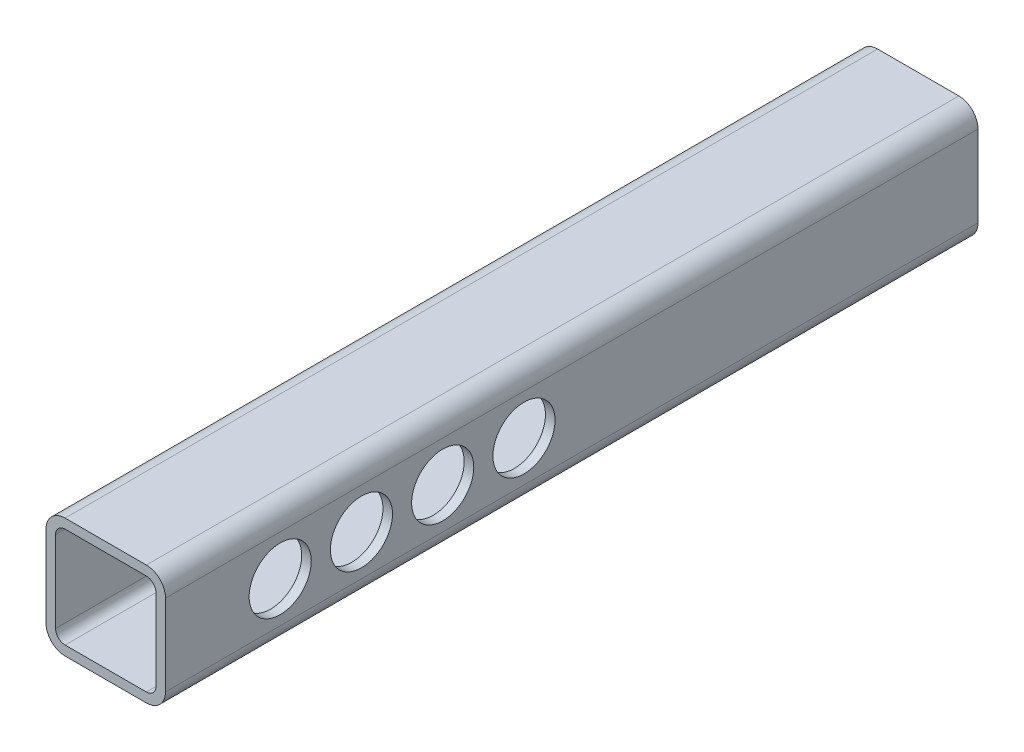
ISO-10303-21;
HEADER;
FILE_DESCRIPTION(('STEP AP214'),'2;1');
FILE_NAME('part.step','',(''),(''),'','','');
FILE_SCHEMA(('AUTOMOTIVE_DESIGN { 1 0 10303 214 1 1 1 1 }'));
ENDSEC;
DATA;
#1=APPLICATION_CONTEXT('core data for automotive mechanical design processes');
#2=APPLICATION_PROTOCOL_DEFINITION('international standard','automotive_design',2000,#1);
#3=PRODUCT_CONTEXT('',#1,'mechanical');
#4=PRODUCT('Part','Part','',(#3));
#5=PRODUCT_RELATED_PRODUCT_CATEGORY('part','',(#4));
#6=PRODUCT_DEFINITION_FORMATION('','',#4);
#7=PRODUCT_DEFINITION_CONTEXT('part definition',#1,'design');
#8=PRODUCT_DEFINITION('design','',#6,#7);
#9=PRODUCT_DEFINITION_SHAPE('','',#8);
#10=(LENGTH_UNIT() NAMED_UNIT(*) SI_UNIT(.MILLI.,.METRE.));
#11=(NAMED_UNIT(*) PLANE_ANGLE_UNIT() SI_UNIT($,.RADIAN.));
#12=(NAMED_UNIT(*) SI_UNIT($,.STERADIAN.) SOLID_ANGLE_UNIT());
#13=UNCERTAINTY_MEASURE_WITH_UNIT(LENGTH_MEASURE(1.E-05),#10,'distance_accuracy_value','');
#14=(GEOMETRIC_REPRESENTATION_CONTEXT(3) GLOBAL_UNCERTAINTY_ASSIGNED_CONTEXT((#13)) GLOBAL_UNIT_ASSIGNED_CONTEXT((#10,
#11,#12)) REPRESENTATION_CONTEXT('',''));
#15=CARTESIAN_POINT('',(0.,0.,0.));
#16=DIRECTION('',(0.,0.,1.));
#17=DIRECTION('',(1.,0.,0.));
#18=AXIS2_PLACEMENT_3D('',#15,#16,#17);
#19=CARTESIAN_POINT('',(-8.5,-8.5,170.));
#20=DIRECTION('',(0.,0.,1.));
#21=DIRECTION('',(1.,0.,0.));
#22=AXIS2_PLACEMENT_3D('',#19,#20,#21);
#23=PLANE('',#22);
#24=CARTESIAN_POINT('',(-8.5,-8.5,170.));
#25=DIRECTION('',(0.,0.,1.));
#26=DIRECTION('',(1.,0.,0.));
#27=AXIS2_PLACEMENT_3D('',#24,#25,#26);
#28=CIRCLE('',#27,4.);
#29=CARTESIAN_POINT('',(-12.5,-8.5,170.));
#30=VERTEX_POINT('',#29);
#31=CARTESIAN_POINT('',(-8.5,-12.5,170.));
#32=VERTEX_POINT('',#31);
#33=EDGE_CURVE('E216',#30,#32,#28,.T.);
#34=ORIENTED_EDGE('',*,*,#33,.T.);
#35=DIRECTION('',(1.,0.,0.));
#36=VECTOR('',#35,1.);
#37=CARTESIAN_POINT('',(8.5,-12.5,170.));
#38=LINE('',#37,#36);
#39=CARTESIAN_POINT('',(8.5,-12.5,170.));
#40=VERTEX_POINT('',#39);
#41=EDGE_CURVE('E219',#32,#40,#38,.T.);
#42=ORIENTED_EDGE('',*,*,#41,.T.);
#43=CARTESIAN_POINT('',(8.5,-8.5,170.));
#44=DIRECTION('',(0.,0.,1.));
#45=DIRECTION('',(1.,0.,0.));
#46=AXIS2_PLACEMENT_3D('',#43,#44,#45);
#47=CIRCLE('',#46,4.);
#48=CARTESIAN_POINT('',(12.5,-8.5,170.));
#49=VERTEX_POINT('',#48);
#50=EDGE_CURVE('E222',#40,#49,#47,.T.);
#51=ORIENTED_EDGE('',*,*,#50,.T.);
#52=DIRECTION('',(0.,1.,0.));
#53=VECTOR('',#52,1.);
#54=CARTESIAN_POINT('',(12.5,-8.5,170.));
#55=LINE('',#54,#53);
#56=CARTESIAN_POINT('',(12.5,8.5,170.));
#57=VERTEX_POINT('',#56);
#58=EDGE_CURVE('E224',#49,#57,#55,.T.);
#59=ORIENTED_EDGE('',*,*,#58,.T.);
#60=CARTESIAN_POINT('',(8.5,8.5,170.));
#61=DIRECTION('',(0.,0.,1.));
#62=DIRECTION('',(1.,0.,0.));
#63=AXIS2_PLACEMENT_3D('',#60,#61,#62);
#64=CIRCLE('',#63,4.);
#65=CARTESIAN_POINT('',(8.5,12.5,170.));
#66=VERTEX_POINT('',#65);
#67=EDGE_CURVE('E226',#57,#66,#64,.T.);
#68=ORIENTED_EDGE('',*,*,#67,.T.);
#69=DIRECTION('',(-1.,0.,0.));
#70=VECTOR('',#69,1.);
#71=CARTESIAN_POINT('',(8.5,12.5,170.));
#72=LINE('',#71,#70);
#73=CARTESIAN_POINT('',(-8.5,12.5,170.));
#74=VERTEX_POINT('',#73);
#75=EDGE_CURVE('E228',#66,#74,#72,.T.);
#76=ORIENTED_EDGE('',*,*,#75,.T.);
#77=CARTESIAN_POINT('',(-8.5,8.5,170.));
#78=DIRECTION('',(0.,0.,1.));
#79=DIRECTION('',(-1.,0.,0.));
#80=AXIS2_PLACEMENT_3D('',#77,#78,#79);
#81=CIRCLE('',#80,4.);
#82=CARTESIAN_POINT('',(-12.5,8.5,170.));
#83=VERTEX_POINT('',#82);
#84=EDGE_CURVE('E230',#74,#83,#81,.T.);
#85=ORIENTED_EDGE('',*,*,#84,.T.);
#86=DIRECTION('',(0.,-1.,0.));
#87=VECTOR('',#86,1.);
#88=CARTESIAN_POINT('',(-12.5,-8.5,170.));
#89=LINE('',#88,#87);
#90=EDGE_CURVE('E232',#83,#30,#89,.T.);
#91=ORIENTED_EDGE('',*,*,#90,.T.);
#92=EDGE_LOOP('',(#34,#42,#51,#59,#68,#76,#85,#91));
#93=FACE_BOUND('',#92,.T.);
#94=DIRECTION('',(1.,0.,0.));
#95=VECTOR('',#94,1.);
#96=CARTESIAN_POINT('',(8.5,-10.5,170.));
#97=LINE('',#96,#95);
#98=CARTESIAN_POINT('',(-8.5,-10.5,170.));
#99=VERTEX_POINT('',#98);
#100=CARTESIAN_POINT('',(8.5,-10.5,170.));
#101=VERTEX_POINT('',#100);
#102=EDGE_CURVE('E157',#99,#101,#97,.T.);
#103=ORIENTED_EDGE('',*,*,#102,.F.);
#104=CARTESIAN_POINT('',(-8.5,-8.5,170.));
#105=DIRECTION('',(0.,0.,1.));
#106=DIRECTION('',(1.,0.,0.));
#107=AXIS2_PLACEMENT_3D('',#104,#105,#106);
#108=CIRCLE('',#107,2.);
#109=CARTESIAN_POINT('',(-10.5,-8.5,170.));
#110=VERTEX_POINT('',#109);
#111=EDGE_CURVE('E149',#110,#99,#108,.T.);
#112=ORIENTED_EDGE('',*,*,#111,.F.);
#113=DIRECTION('',(0.,-1.,0.));
#114=VECTOR('',#113,1.);
#115=CARTESIAN_POINT('',(-10.5,-8.5,170.));
#116=LINE('',#115,#114);
#117=CARTESIAN_POINT('',(-10.5,8.5,170.));
#118=VERTEX_POINT('',#117);
#119=EDGE_CURVE('E183',#118,#110,#116,.T.);
#120=ORIENTED_EDGE('',*,*,#119,.F.);
#121=CARTESIAN_POINT('',(-8.5,8.5,170.));
#122=DIRECTION('',(0.,0.,1.));
#123=DIRECTION('',(-1.,0.,0.));
#124=AXIS2_PLACEMENT_3D('',#121,#122,#123);
#125=CIRCLE('',#124,2.);
#126=CARTESIAN_POINT('',(-8.5,10.5,170.));
#127=VERTEX_POINT('',#126);
#128=EDGE_CURVE('E181',#127,#118,#125,.T.);
#129=ORIENTED_EDGE('',*,*,#128,.F.);
#130=DIRECTION('',(-1.,0.,0.));
#131=VECTOR('',#130,1.);
#132=CARTESIAN_POINT('',(8.5,10.5,170.));
#133=LINE('',#132,#131);
#134=CARTESIAN_POINT('',(8.5,10.5,170.));
#135=VERTEX_POINT('',#134);
#136=EDGE_CURVE('E179',#135,#127,#133,.T.);
#137=ORIENTED_EDGE('',*,*,#136,.F.);
#138=CARTESIAN_POINT('',(8.5,8.5,170.));
#139=DIRECTION('',(0.,0.,1.));
#140=DIRECTION('',(1.,0.,0.));
#141=AXIS2_PLACEMENT_3D('',#138,#139,#140);
#142=CIRCLE('',#141,2.);
#143=CARTESIAN_POINT('',(10.5,8.5,170.));
#144=VERTEX_POINT('',#143);
#145=EDGE_CURVE('E177',#144,#135,#142,.T.);
#146=ORIENTED_EDGE('',*,*,#145,.F.);
#147=DIRECTION('',(0.,1.,0.));
#148=VECTOR('',#147,1.);
#149=CARTESIAN_POINT('',(10.5,-8.5,170.));
#150=LINE('',#149,#148);
#151=CARTESIAN_POINT('',(10.5,-8.5,170.));
#152=VERTEX_POINT('',#151);
#153=EDGE_CURVE('E172',#152,#144,#150,.T.);
#154=ORIENTED_EDGE('',*,*,#153,.F.);
#155=CARTESIAN_POINT('',(8.5,-8.5,170.));
#156=DIRECTION('',(0.,0.,1.));
#157=DIRECTION('',(1.,0.,0.));
#158=AXIS2_PLACEMENT_3D('',#155,#156,#157);
#159=CIRCLE('',#158,2.);
#160=EDGE_CURVE('E170',#101,#152,#159,.T.);
#161=ORIENTED_EDGE('',*,*,#160,.F.);
#162=EDGE_LOOP('',(#103,#112,#120,#129,#137,#146,#154,#161));
#163=FACE_BOUND('',#162,.T.);
#164=ADVANCED_FACE('F34',(#93,#163),#23,.T.);
#165=CARTESIAN_POINT('',(-8.5,-8.5,0.));
#166=DIRECTION('',(0.,0.,1.));
#167=DIRECTION('',(1.,0.,0.));
#168=AXIS2_PLACEMENT_3D('',#165,#166,#167);
#169=PLANE('',#168);
#170=CARTESIAN_POINT('',(-8.5,-8.5,0.));
#171=DIRECTION('',(0.,0.,1.));
#172=DIRECTION('',(1.,0.,0.));
#173=AXIS2_PLACEMENT_3D('',#170,#171,#172);
#174=CIRCLE('',#173,4.);
#175=CARTESIAN_POINT('',(-12.5,-8.5,0.));
#176=VERTEX_POINT('',#175);
#177=CARTESIAN_POINT('',(-8.5,-12.5,0.));
#178=VERTEX_POINT('',#177);
#179=EDGE_CURVE('E165',#176,#178,#174,.T.);
#180=ORIENTED_EDGE('',*,*,#179,.F.);
#181=DIRECTION('',(0.,-1.,0.));
#182=VECTOR('',#181,1.);
#183=CARTESIAN_POINT('',(-12.5,-8.5,0.));
#184=LINE('',#183,#182);
#185=CARTESIAN_POINT('',(-12.5,8.5,0.));
#186=VERTEX_POINT('',#185);
#187=EDGE_CURVE('E220',#186,#176,#184,.T.);
#188=ORIENTED_EDGE('',*,*,#187,.F.);
#189=CARTESIAN_POINT('',(-8.5,8.5,0.));
#190=DIRECTION('',(0.,0.,1.));
#191=DIRECTION('',(-1.,0.,0.));
#192=AXIS2_PLACEMENT_3D('',#189,#190,#191);
#193=CIRCLE('',#192,4.);
#194=CARTESIAN_POINT('',(-8.5,12.5,0.));
#195=VERTEX_POINT('',#194);
#196=EDGE_CURVE('E247',#195,#186,#193,.T.);
#197=ORIENTED_EDGE('',*,*,#196,.F.);
#198=DIRECTION('',(-1.,0.,0.));
#199=VECTOR('',#198,1.);
#200=CARTESIAN_POINT('',(8.5,12.5,0.));
#201=LINE('',#200,#199);
#202=CARTESIAN_POINT('',(8.5,12.5,0.));
#203=VERTEX_POINT('',#202);
#204=EDGE_CURVE('E245',#203,#195,#201,.T.);
#205=ORIENTED_EDGE('',*,*,#204,.F.);
#206=CARTESIAN_POINT('',(8.5,8.5,0.));
#207=DIRECTION('',(0.,0.,1.));
#208=DIRECTION('',(1.,0.,0.));
#209=AXIS2_PLACEMENT_3D('',#206,#207,#208);
#210=CIRCLE('',#209,4.);
#211=CARTESIAN_POINT('',(12.5,8.5,0.));
#212=VERTEX_POINT('',#211);
#213=EDGE_CURVE('E243',#212,#203,#210,.T.);
#214=ORIENTED_EDGE('',*,*,#213,.F.);
#215=DIRECTION('',(0.,1.,0.));
#216=VECTOR('',#215,1.);
#217=CARTESIAN_POINT('',(12.5,-8.5,0.));
#218=LINE('',#217,#216);
#219=CARTESIAN_POINT('',(12.5,-8.5,0.));
#220=VERTEX_POINT('',#219);
#221=EDGE_CURVE('E241',#220,#212,#218,.T.);
#222=ORIENTED_EDGE('',*,*,#221,.F.);
#223=CARTESIAN_POINT('',(8.5,-8.5,0.));
#224=DIRECTION('',(0.,0.,1.));
#225=DIRECTION('',(1.,0.,0.));
#226=AXIS2_PLACEMENT_3D('',#223,#224,#225);
#227=CIRCLE('',#226,4.);
#228=CARTESIAN_POINT('',(8.5,-12.5,0.));
#229=VERTEX_POINT('',#228);
#230=EDGE_CURVE('E239',#229,#220,#227,.T.);
#231=ORIENTED_EDGE('',*,*,#230,.F.);
#232=DIRECTION('',(1.,0.,0.));
#233=VECTOR('',#232,1.);
#234=CARTESIAN_POINT('',(8.5,-12.5,0.));
#235=LINE('',#234,#233);
#236=EDGE_CURVE('E237',#178,#229,#235,.T.);
#237=ORIENTED_EDGE('',*,*,#236,.F.);
#238=EDGE_LOOP('',(#180,#188,#197,#205,#214,#222,#231,#237));
#239=FACE_BOUND('',#238,.T.);
#240=CARTESIAN_POINT('',(-8.5,-8.5,0.));
#241=DIRECTION('',(0.,0.,1.));
#242=DIRECTION('',(1.,0.,0.));
#243=AXIS2_PLACEMENT_3D('',#240,#241,#242);
#244=CIRCLE('',#243,2.);
#245=CARTESIAN_POINT('',(-10.5,-8.5,0.));
#246=VERTEX_POINT('',#245);
#247=CARTESIAN_POINT('',(-8.5,-10.5,0.));
#248=VERTEX_POINT('',#247);
#249=EDGE_CURVE('E59',#246,#248,#244,.T.);
#250=ORIENTED_EDGE('',*,*,#249,.T.);
#251=DIRECTION('',(1.,0.,0.));
#252=VECTOR('',#251,1.);
#253=CARTESIAN_POINT('',(8.5,-10.5,0.));
#254=LINE('',#253,#252);
#255=CARTESIAN_POINT('',(8.5,-10.5,0.));
#256=VERTEX_POINT('',#255);
#257=EDGE_CURVE('E164',#248,#256,#254,.T.);
#258=ORIENTED_EDGE('',*,*,#257,.T.);
#259=CARTESIAN_POINT('',(8.5,-8.5,0.));
#260=DIRECTION('',(0.,0.,1.));
#261=DIRECTION('',(1.,0.,0.));
#262=AXIS2_PLACEMENT_3D('',#259,#260,#261);
#263=CIRCLE('',#262,2.);
#264=CARTESIAN_POINT('',(10.5,-8.5,0.));
#265=VERTEX_POINT('',#264);
#266=EDGE_CURVE('E188',#256,#265,#263,.T.);
#267=ORIENTED_EDGE('',*,*,#266,.T.);
#268=DIRECTION('',(0.,1.,0.));
#269=VECTOR('',#268,1.);
#270=CARTESIAN_POINT('',(10.5,-8.5,0.));
#271=LINE('',#270,#269);
#272=CARTESIAN_POINT('',(10.5,8.5,0.));
#273=VERTEX_POINT('',#272);
#274=EDGE_CURVE('E191',#265,#273,#271,.T.);
#275=ORIENTED_EDGE('',*,*,#274,.T.);
#276=CARTESIAN_POINT('',(8.5,8.5,0.));
#277=DIRECTION('',(0.,0.,1.));
#278=DIRECTION('',(1.,0.,0.));
#279=AXIS2_PLACEMENT_3D('',#276,#277,#278);
#280=CIRCLE('',#279,2.);
#281=CARTESIAN_POINT('',(8.5,10.5,0.));
#282=VERTEX_POINT('',#281);
#283=EDGE_CURVE('E194',#273,#282,#280,.T.);
#284=ORIENTED_EDGE('',*,*,#283,.T.);
#285=DIRECTION('',(-1.,0.,0.));
#286=VECTOR('',#285,1.);
#287=CARTESIAN_POINT('',(8.5,10.5,0.));
#288=LINE('',#287,#286);
#289=CARTESIAN_POINT('',(-8.5,10.5,0.));
#290=VERTEX_POINT('',#289);
#291=EDGE_CURVE('E197',#282,#290,#288,.T.);
#292=ORIENTED_EDGE('',*,*,#291,.T.);
#293=CARTESIAN_POINT('',(-8.5,8.5,0.));
#294=DIRECTION('',(0.,0.,1.));
#295=DIRECTION('',(-1.,0.,0.));
#296=AXIS2_PLACEMENT_3D('',#293,#294,#295);
#297=CIRCLE('',#296,2.);
#298=CARTESIAN_POINT('',(-10.5,8.5,0.));
#299=VERTEX_POINT('',#298);
#300=EDGE_CURVE('E200',#290,#299,#297,.T.);
#301=ORIENTED_EDGE('',*,*,#300,.T.);
#302=DIRECTION('',(0.,-1.,0.));
#303=VECTOR('',#302,1.);
#304=CARTESIAN_POINT('',(-10.5,-8.5,0.));
#305=LINE('',#304,#303);
#306=EDGE_CURVE('E158',#299,#246,#305,.T.);
#307=ORIENTED_EDGE('',*,*,#306,.T.);
#308=EDGE_LOOP('',(#250,#258,#267,#275,#284,#292,#301,#307));
#309=FACE_BOUND('',#308,.T.);
#310=ADVANCED_FACE('F326',(#239,#309),#169,.F.);
#311=CARTESIAN_POINT('',(-8.5,-8.5,170.));
#312=DIRECTION('',(0.,0.,-1.));
#313=DIRECTION('',(-1.,0.,0.));
#314=AXIS2_PLACEMENT_3D('',#311,#312,#313);
#315=CYLINDRICAL_SURFACE('',#314,4.);
#316=ORIENTED_EDGE('',*,*,#179,.T.);
#317=DIRECTION('',(0.,0.,-1.));
#318=VECTOR('',#317,1.);
#319=CARTESIAN_POINT('',(-8.5,-12.5,170.));
#320=LINE('',#319,#318);
#321=EDGE_CURVE('E11',#32,#178,#320,.T.);
#322=ORIENTED_EDGE('',*,*,#321,.F.);
#323=ORIENTED_EDGE('',*,*,#33,.F.);
#324=DIRECTION('',(0.,0.,-1.));
#325=VECTOR('',#324,1.);
#326=CARTESIAN_POINT('',(-12.5,-8.5,170.));
#327=LINE('',#326,#325);
#328=EDGE_CURVE('E234',#30,#176,#327,.T.);
#329=ORIENTED_EDGE('',*,*,#328,.T.);
#330=EDGE_LOOP('',(#316,#322,#323,#329));
#331=FACE_BOUND('',#330,.T.);
#332=ADVANCED_FACE('F36',(#331),#315,.T.);
#333=CARTESIAN_POINT('',(8.5,-12.5,170.));
#334=DIRECTION('',(0.,1.,0.));
#335=DIRECTION('',(-1.,0.,0.));
#336=AXIS2_PLACEMENT_3D('',#333,#334,#335);
#337=PLANE('',#336);
#338=ORIENTED_EDGE('',*,*,#236,.T.);
#339=DIRECTION('',(0.,0.,-1.));
#340=VECTOR('',#339,1.);
#341=CARTESIAN_POINT('',(8.5,-12.5,170.));
#342=LINE('',#341,#340);
#343=EDGE_CURVE('E43',#40,#229,#342,.T.);
#344=ORIENTED_EDGE('',*,*,#343,.F.);
#345=ORIENTED_EDGE('',*,*,#41,.F.);
#346=ORIENTED_EDGE('',*,*,#321,.T.);
#347=EDGE_LOOP('',(#338,#344,#345,#346));
#348=FACE_BOUND('',#347,.T.);
#349=ADVANCED_FACE('F366',(#348),#337,.F.);
#350=CARTESIAN_POINT('',(8.5,-8.5,170.));
#351=DIRECTION('',(0.,0.,-1.));
#352=DIRECTION('',(-1.,0.,0.));
#353=AXIS2_PLACEMENT_3D('',#350,#351,#352);
#354=CYLINDRICAL_SURFACE('',#353,4.);
#355=ORIENTED_EDGE('',*,*,#230,.T.);
#356=DIRECTION('',(0.,0.,-1.));
#357=VECTOR('',#356,1.);
#358=CARTESIAN_POINT('',(12.5,-8.5,170.));
#359=LINE('',#358,#357);
#360=EDGE_CURVE('E264',#49,#220,#359,.T.);
#361=ORIENTED_EDGE('',*,*,#360,.F.);
#362=ORIENTED_EDGE('',*,*,#50,.F.);
#363=ORIENTED_EDGE('',*,*,#343,.T.);
#364=EDGE_LOOP('',(#355,#361,#362,#363));
#365=FACE_BOUND('',#364,.T.);
#366=ADVANCED_FACE('F363',(#365),#354,.T.);
#367=CARTESIAN_POINT('',(12.5,-8.5,170.));
#368=DIRECTION('',(-1.,0.,0.));
#369=DIRECTION('',(0.,0.,1.));
#370=AXIS2_PLACEMENT_3D('',#367,#368,#369);
#371=PLANE('',#370);
#372=CARTESIAN_POINT('',(12.5,0.,95.));
#373=DIRECTION('',(1.,0.,0.));
#374=DIRECTION('',(0.,0.,-1.));
#375=AXIS2_PLACEMENT_3D('',#372,#373,#374);
#376=CIRCLE('',#375,6.5);
#377=CARTESIAN_POINT('',(12.5,0.,88.5));
#378=VERTEX_POINT('',#377);
#379=EDGE_CURVE('E602',#378,#378,#376,.T.);
#380=ORIENTED_EDGE('',*,*,#379,.F.);
#381=EDGE_LOOP('',(#380));
#382=FACE_BOUND('',#381,.T.);
#383=CARTESIAN_POINT('',(12.5,0.,112.));
#384=DIRECTION('',(1.,0.,0.));
#385=DIRECTION('',(0.,0.,-1.));
#386=AXIS2_PLACEMENT_3D('',#383,#384,#385);
#387=CIRCLE('',#386,6.5);
#388=CARTESIAN_POINT('',(12.5,0.,105.5));
#389=VERTEX_POINT('',#388);
#390=EDGE_CURVE('E287',#389,#389,#387,.T.);
#391=ORIENTED_EDGE('',*,*,#390,.F.);
#392=EDGE_LOOP('',(#391));
#393=FACE_BOUND('',#392,.T.);
#394=CARTESIAN_POINT('',(12.5,0.,129.));
#395=DIRECTION('',(1.,0.,0.));
#396=DIRECTION('',(0.,0.,-1.));
#397=AXIS2_PLACEMENT_3D('',#394,#395,#396);
#398=CIRCLE('',#397,6.50000000000002);
#399=CARTESIAN_POINT('',(12.5,0.,122.5));
#400=VERTEX_POINT('',#399);
#401=EDGE_CURVE('E284',#400,#400,#398,.T.);
#402=ORIENTED_EDGE('',*,*,#401,.F.);
#403=EDGE_LOOP('',(#402));
#404=FACE_BOUND('',#403,.T.);
#405=CARTESIAN_POINT('',(12.5,0.,146.));
#406=DIRECTION('',(1.,0.,0.));
#407=DIRECTION('',(0.,0.,-1.));
#408=AXIS2_PLACEMENT_3D('',#405,#406,#407);
#409=CIRCLE('',#408,6.50000000000002);
#410=CARTESIAN_POINT('',(12.5,0.,139.5));
#411=VERTEX_POINT('',#410);
#412=EDGE_CURVE('E303',#411,#411,#409,.T.);
#413=ORIENTED_EDGE('',*,*,#412,.F.);
#414=EDGE_LOOP('',(#413));
#415=FACE_BOUND('',#414,.T.);
#416=ORIENTED_EDGE('',*,*,#221,.T.);
#417=DIRECTION('',(0.,0.,-1.));
#418=VECTOR('',#417,1.);
#419=CARTESIAN_POINT('',(12.5,8.5,170.));
#420=LINE('',#419,#418);
#421=EDGE_CURVE('E261',#57,#212,#420,.T.);
#422=ORIENTED_EDGE('',*,*,#421,.F.);
#423=ORIENTED_EDGE('',*,*,#58,.F.);
#424=ORIENTED_EDGE('',*,*,#360,.T.);
#425=EDGE_LOOP('',(#416,#422,#423,#424));
#426=FACE_BOUND('',#425,.T.);
#427=ADVANCED_FACE('F359',(#382,#393,#404,#415,#426),#371,.F.);
#428=CARTESIAN_POINT('',(8.5,8.5,170.));
#429=DIRECTION('',(0.,0.,-1.));
#430=DIRECTION('',(-1.,0.,0.));
#431=AXIS2_PLACEMENT_3D('',#428,#429,#430);
#432=CYLINDRICAL_SURFACE('',#431,4.);
#433=ORIENTED_EDGE('',*,*,#213,.T.);
#434=DIRECTION('',(0.,0.,-1.));
#435=VECTOR('',#434,1.);
#436=CARTESIAN_POINT('',(8.5,12.5,170.));
#437=LINE('',#436,#435);
#438=EDGE_CURVE('E258',#66,#203,#437,.T.);
#439=ORIENTED_EDGE('',*,*,#438,.F.);
#440=ORIENTED_EDGE('',*,*,#67,.F.);
#441=ORIENTED_EDGE('',*,*,#421,.T.);
#442=EDGE_LOOP('',(#433,#439,#440,#441));
#443=FACE_BOUND('',#442,.T.);
#444=ADVANCED_FACE('F355',(#443),#432,.T.);
#445=CARTESIAN_POINT('',(8.5,12.5,170.));
#446=DIRECTION('',(0.,-1.,0.));
#447=DIRECTION('',(0.,0.,-1.));
#448=AXIS2_PLACEMENT_3D('',#445,#446,#447);
#449=PLANE('',#448);
#450=ORIENTED_EDGE('',*,*,#204,.T.);
#451=DIRECTION('',(0.,0.,-1.));
#452=VECTOR('',#451,1.);
#453=CARTESIAN_POINT('',(-8.5,12.5,170.));
#454=LINE('',#453,#452);
#455=EDGE_CURVE('E255',#74,#195,#454,.T.);
#456=ORIENTED_EDGE('',*,*,#455,.F.);
#457=ORIENTED_EDGE('',*,*,#75,.F.);
#458=ORIENTED_EDGE('',*,*,#438,.T.);
#459=EDGE_LOOP('',(#450,#456,#457,#458));
#460=FACE_BOUND('',#459,.T.);
#461=ADVANCED_FACE('F351',(#460),#449,.F.);
#462=CARTESIAN_POINT('',(-8.5,8.5,170.));
#463=DIRECTION('',(0.,0.,-1.));
#464=DIRECTION('',(-1.,0.,0.));
#465=AXIS2_PLACEMENT_3D('',#462,#463,#464);
#466=CYLINDRICAL_SURFACE('',#465,4.);
#467=ORIENTED_EDGE('',*,*,#196,.T.);
#468=DIRECTION('',(0.,0.,-1.));
#469=VECTOR('',#468,1.);
#470=CARTESIAN_POINT('',(-12.5,8.5,170.));
#471=LINE('',#470,#469);
#472=EDGE_CURVE('E252',#83,#186,#471,.T.);
#473=ORIENTED_EDGE('',*,*,#472,.F.);
#474=ORIENTED_EDGE('',*,*,#84,.F.);
#475=ORIENTED_EDGE('',*,*,#455,.T.);
#476=EDGE_LOOP('',(#467,#473,#474,#475));
#477=FACE_BOUND('',#476,.T.);
#478=ADVANCED_FACE('F347',(#477),#466,.T.);
#479=CARTESIAN_POINT('',(-12.5,-8.5,170.));
#480=DIRECTION('',(1.,0.,0.));
#481=DIRECTION('',(0.,0.,-1.));
#482=AXIS2_PLACEMENT_3D('',#479,#480,#481);
#483=PLANE('',#482);
#484=CARTESIAN_POINT('',(-12.5,0.,95.));
#485=DIRECTION('',(1.,0.,0.));
#486=DIRECTION('',(0.,0.,-1.));
#487=AXIS2_PLACEMENT_3D('',#484,#485,#486);
#488=CIRCLE('',#487,6.5);
#489=CARTESIAN_POINT('',(-12.5,0.,88.5));
#490=VERTEX_POINT('',#489);
#491=EDGE_CURVE('E603',#490,#490,#488,.T.);
#492=ORIENTED_EDGE('',*,*,#491,.T.);
#493=EDGE_LOOP('',(#492));
#494=FACE_BOUND('',#493,.T.);
#495=CARTESIAN_POINT('',(-12.5,0.,112.));
#496=DIRECTION('',(1.,0.,0.));
#497=DIRECTION('',(0.,0.,-1.));
#498=AXIS2_PLACEMENT_3D('',#495,#496,#497);
#499=CIRCLE('',#498,6.5);
#500=CARTESIAN_POINT('',(-12.5,0.,105.5));
#501=VERTEX_POINT('',#500);
#502=EDGE_CURVE('E280',#501,#501,#499,.T.);
#503=ORIENTED_EDGE('',*,*,#502,.T.);
#504=EDGE_LOOP('',(#503));
#505=FACE_BOUND('',#504,.T.);
#506=CARTESIAN_POINT('',(-12.5,0.,129.));
#507=DIRECTION('',(1.,0.,0.));
#508=DIRECTION('',(0.,0.,-1.));
#509=AXIS2_PLACEMENT_3D('',#506,#507,#508);
#510=CIRCLE('',#509,6.50000000000002);
#511=CARTESIAN_POINT('',(-12.5,0.,122.5));
#512=VERTEX_POINT('',#511);
#513=EDGE_CURVE('E276',#512,#512,#510,.T.);
#514=ORIENTED_EDGE('',*,*,#513,.T.);
#515=EDGE_LOOP('',(#514));
#516=FACE_BOUND('',#515,.T.);
#517=CARTESIAN_POINT('',(-12.5,0.,146.));
#518=DIRECTION('',(1.,0.,0.));
#519=DIRECTION('',(0.,0.,-1.));
#520=AXIS2_PLACEMENT_3D('',#517,#518,#519);
#521=CIRCLE('',#520,6.50000000000002);
#522=CARTESIAN_POINT('',(-12.5,0.,139.5));
#523=VERTEX_POINT('',#522);
#524=EDGE_CURVE('E272',#523,#523,#521,.T.);
#525=ORIENTED_EDGE('',*,*,#524,.T.);
#526=EDGE_LOOP('',(#525));
#527=FACE_BOUND('',#526,.T.);
#528=ORIENTED_EDGE('',*,*,#187,.T.);
#529=ORIENTED_EDGE('',*,*,#328,.F.);
#530=ORIENTED_EDGE('',*,*,#90,.F.);
#531=ORIENTED_EDGE('',*,*,#472,.T.);
#532=EDGE_LOOP('',(#528,#529,#530,#531));
#533=FACE_BOUND('',#532,.T.);
#534=ADVANCED_FACE('F344',(#494,#505,#516,#527,#533),#483,.F.);
#535=CARTESIAN_POINT('',(-8.5,-8.5,170.));
#536=DIRECTION('',(0.,0.,-1.));
#537=DIRECTION('',(-1.,0.,0.));
#538=AXIS2_PLACEMENT_3D('',#535,#536,#537);
#539=CYLINDRICAL_SURFACE('',#538,2.);
#540=ORIENTED_EDGE('',*,*,#249,.F.);
#541=DIRECTION('',(0.,0.,-1.));
#542=VECTOR('',#541,1.);
#543=CARTESIAN_POINT('',(-10.5,-8.5,170.));
#544=LINE('',#543,#542);
#545=EDGE_CURVE('E153',#110,#246,#544,.T.);
#546=ORIENTED_EDGE('',*,*,#545,.F.);
#547=ORIENTED_EDGE('',*,*,#111,.T.);
#548=DIRECTION('',(0.,0.,-1.));
#549=VECTOR('',#548,1.);
#550=CARTESIAN_POINT('',(-8.5,-10.5,170.));
#551=LINE('',#550,#549);
#552=EDGE_CURVE('E152',#99,#248,#551,.T.);
#553=ORIENTED_EDGE('',*,*,#552,.T.);
#554=EDGE_LOOP('',(#540,#546,#547,#553));
#555=FACE_BOUND('',#554,.T.);
#556=ADVANCED_FACE('F151',(#555),#539,.F.);
#557=CARTESIAN_POINT('',(8.5,-10.5,170.));
#558=DIRECTION('',(0.,1.,0.));
#559=DIRECTION('',(-1.,0.,0.));
#560=AXIS2_PLACEMENT_3D('',#557,#558,#559);
#561=PLANE('',#560);
#562=ORIENTED_EDGE('',*,*,#257,.F.);
#563=ORIENTED_EDGE('',*,*,#552,.F.);
#564=ORIENTED_EDGE('',*,*,#102,.T.);
#565=DIRECTION('',(0.,0.,-1.));
#566=VECTOR('',#565,1.);
#567=CARTESIAN_POINT('',(8.5,-10.5,170.));
#568=LINE('',#567,#566);
#569=EDGE_CURVE('E166',#101,#256,#568,.T.);
#570=ORIENTED_EDGE('',*,*,#569,.T.);
#571=EDGE_LOOP('',(#562,#563,#564,#570));
#572=FACE_BOUND('',#571,.T.);
#573=ADVANCED_FACE('F161',(#572),#561,.T.);
#574=CARTESIAN_POINT('',(8.5,-8.5,170.));
#575=DIRECTION('',(0.,0.,-1.));
#576=DIRECTION('',(-1.,0.,0.));
#577=AXIS2_PLACEMENT_3D('',#574,#575,#576);
#578=CYLINDRICAL_SURFACE('',#577,2.);
#579=ORIENTED_EDGE('',*,*,#266,.F.);
#580=ORIENTED_EDGE('',*,*,#569,.F.);
#581=ORIENTED_EDGE('',*,*,#160,.T.);
#582=DIRECTION('',(0.,0.,-1.));
#583=VECTOR('',#582,1.);
#584=CARTESIAN_POINT('',(10.5,-8.5,170.));
#585=LINE('',#584,#583);
#586=EDGE_CURVE('E213',#152,#265,#585,.T.);
#587=ORIENTED_EDGE('',*,*,#586,.T.);
#588=EDGE_LOOP('',(#579,#580,#581,#587));
#589=FACE_BOUND('',#588,.T.);
#590=ADVANCED_FACE('F317',(#589),#578,.F.);
#591=CARTESIAN_POINT('',(10.5,-8.5,170.));
#592=DIRECTION('',(-1.,0.,0.));
#593=DIRECTION('',(0.,0.,1.));
#594=AXIS2_PLACEMENT_3D('',#591,#592,#593);
#595=PLANE('',#594);
#596=CARTESIAN_POINT('',(10.5,0.,95.));
#597=DIRECTION('',(-1.,0.,0.));
#598=DIRECTION('',(0.,0.,1.));
#599=AXIS2_PLACEMENT_3D('',#596,#597,#598);
#600=CIRCLE('',#599,6.5);
#601=CARTESIAN_POINT('',(10.5,0.,101.5));
#602=VERTEX_POINT('',#601);
#603=EDGE_CURVE('E292',#602,#602,#600,.T.);
#604=ORIENTED_EDGE('',*,*,#603,.F.);
#605=EDGE_LOOP('',(#604));
#606=FACE_BOUND('',#605,.T.);
#607=CARTESIAN_POINT('',(10.5,0.,112.));
#608=DIRECTION('',(-1.,0.,0.));
#609=DIRECTION('',(0.,0.,1.));
#610=AXIS2_PLACEMENT_3D('',#607,#608,#609);
#611=CIRCLE('',#610,6.5);
#612=CARTESIAN_POINT('',(10.5,0.,118.5));
#613=VERTEX_POINT('',#612);
#614=EDGE_CURVE('E279',#613,#613,#611,.T.);
#615=ORIENTED_EDGE('',*,*,#614,.F.);
#616=EDGE_LOOP('',(#615));
#617=FACE_BOUND('',#616,.T.);
#618=CARTESIAN_POINT('',(10.5,0.,129.));
#619=DIRECTION('',(-1.,0.,0.));
#620=DIRECTION('',(0.,0.,1.));
#621=AXIS2_PLACEMENT_3D('',#618,#619,#620);
#622=CIRCLE('',#621,6.50000000000002);
#623=CARTESIAN_POINT('',(10.5,0.,135.5));
#624=VERTEX_POINT('',#623);
#625=EDGE_CURVE('E275',#624,#624,#622,.T.);
#626=ORIENTED_EDGE('',*,*,#625,.F.);
#627=EDGE_LOOP('',(#626));
#628=FACE_BOUND('',#627,.T.);
#629=CARTESIAN_POINT('',(10.5,0.,146.));
#630=DIRECTION('',(-1.,0.,0.));
#631=DIRECTION('',(0.,0.,1.));
#632=AXIS2_PLACEMENT_3D('',#629,#630,#631);
#633=CIRCLE('',#632,6.50000000000002);
#634=CARTESIAN_POINT('',(10.5,0.,152.5));
#635=VERTEX_POINT('',#634);
#636=EDGE_CURVE('E186',#635,#635,#633,.T.);
#637=ORIENTED_EDGE('',*,*,#636,.F.);
#638=EDGE_LOOP('',(#637));
#639=FACE_BOUND('',#638,.T.);
#640=ORIENTED_EDGE('',*,*,#274,.F.);
#641=ORIENTED_EDGE('',*,*,#586,.F.);
#642=ORIENTED_EDGE('',*,*,#153,.T.);
#643=DIRECTION('',(0.,0.,-1.));
#644=VECTOR('',#643,1.);
#645=CARTESIAN_POINT('',(10.5,8.5,170.));
#646=LINE('',#645,#644);
#647=EDGE_CURVE('E211',#144,#273,#646,.T.);
#648=ORIENTED_EDGE('',*,*,#647,.T.);
#649=EDGE_LOOP('',(#640,#641,#642,#648));
#650=FACE_BOUND('',#649,.T.);
#651=ADVANCED_FACE('F313',(#606,#617,#628,#639,#650),#595,.T.);
#652=CARTESIAN_POINT('',(8.5,8.5,170.));
#653=DIRECTION('',(0.,0.,-1.));
#654=DIRECTION('',(-1.,0.,0.));
#655=AXIS2_PLACEMENT_3D('',#652,#653,#654);
#656=CYLINDRICAL_SURFACE('',#655,2.);
#657=ORIENTED_EDGE('',*,*,#283,.F.);
#658=ORIENTED_EDGE('',*,*,#647,.F.);
#659=ORIENTED_EDGE('',*,*,#145,.T.);
#660=DIRECTION('',(0.,0.,-1.));
#661=VECTOR('',#660,1.);
#662=CARTESIAN_POINT('',(8.5,10.5,170.));
#663=LINE('',#662,#661);
#664=EDGE_CURVE('E209',#135,#282,#663,.T.);
#665=ORIENTED_EDGE('',*,*,#664,.T.);
#666=EDGE_LOOP('',(#657,#658,#659,#665));
#667=FACE_BOUND('',#666,.T.);
#668=ADVANCED_FACE('F316',(#667),#656,.F.);
#669=CARTESIAN_POINT('',(8.5,10.5,170.));
#670=DIRECTION('',(0.,-1.,0.));
#671=DIRECTION('',(1.,0.,0.));
#672=AXIS2_PLACEMENT_3D('',#669,#670,#671);
#673=PLANE('',#672);
#674=ORIENTED_EDGE('',*,*,#291,.F.);
#675=ORIENTED_EDGE('',*,*,#664,.F.);
#676=ORIENTED_EDGE('',*,*,#136,.T.);
#677=DIRECTION('',(0.,0.,-1.));
#678=VECTOR('',#677,1.);
#679=CARTESIAN_POINT('',(-8.5,10.5,170.));
#680=LINE('',#679,#678);
#681=EDGE_CURVE('E207',#127,#290,#680,.T.);
#682=ORIENTED_EDGE('',*,*,#681,.T.);
#683=EDGE_LOOP('',(#674,#675,#676,#682));
#684=FACE_BOUND('',#683,.T.);
#685=ADVANCED_FACE('F475',(#684),#673,.T.);
#686=CARTESIAN_POINT('',(-8.5,8.5,170.));
#687=DIRECTION('',(0.,0.,-1.));
#688=DIRECTION('',(-1.,0.,0.));
#689=AXIS2_PLACEMENT_3D('',#686,#687,#688);
#690=CYLINDRICAL_SURFACE('',#689,2.);
#691=ORIENTED_EDGE('',*,*,#300,.F.);
#692=ORIENTED_EDGE('',*,*,#681,.F.);
#693=ORIENTED_EDGE('',*,*,#128,.T.);
#694=DIRECTION('',(0.,0.,-1.));
#695=VECTOR('',#694,1.);
#696=CARTESIAN_POINT('',(-10.5,8.5,170.));
#697=LINE('',#696,#695);
#698=EDGE_CURVE('E51',#118,#299,#697,.T.);
#699=ORIENTED_EDGE('',*,*,#698,.T.);
#700=EDGE_LOOP('',(#691,#692,#693,#699));
#701=FACE_BOUND('',#700,.T.);
#702=ADVANCED_FACE('F485',(#701),#690,.F.);
#703=CARTESIAN_POINT('',(-10.5,-8.5,170.));
#704=DIRECTION('',(1.,0.,0.));
#705=DIRECTION('',(0.,0.,-1.));
#706=AXIS2_PLACEMENT_3D('',#703,#704,#705);
#707=PLANE('',#706);
#708=CARTESIAN_POINT('',(-10.5,0.,95.));
#709=DIRECTION('',(1.,0.,0.));
#710=DIRECTION('',(0.,0.,-1.));
#711=AXIS2_PLACEMENT_3D('',#708,#709,#710);
#712=CIRCLE('',#711,6.5);
#713=CARTESIAN_POINT('',(-10.5,0.,88.5));
#714=VERTEX_POINT('',#713);
#715=EDGE_CURVE('E38',#714,#714,#712,.T.);
#716=ORIENTED_EDGE('',*,*,#715,.F.);
#717=EDGE_LOOP('',(#716));
#718=FACE_BOUND('',#717,.T.);
#719=CARTESIAN_POINT('',(-10.5,0.,112.));
#720=DIRECTION('',(1.,0.,0.));
#721=DIRECTION('',(0.,0.,-1.));
#722=AXIS2_PLACEMENT_3D('',#719,#720,#721);
#723=CIRCLE('',#722,6.5);
#724=CARTESIAN_POINT('',(-10.5,0.,105.5));
#725=VERTEX_POINT('',#724);
#726=EDGE_CURVE('E277',#725,#725,#723,.T.);
#727=ORIENTED_EDGE('',*,*,#726,.F.);
#728=EDGE_LOOP('',(#727));
#729=FACE_BOUND('',#728,.T.);
#730=CARTESIAN_POINT('',(-10.5,0.,129.));
#731=DIRECTION('',(1.,0.,0.));
#732=DIRECTION('',(0.,0.,-1.));
#733=AXIS2_PLACEMENT_3D('',#730,#731,#732);
#734=CIRCLE('',#733,6.50000000000002);
#735=CARTESIAN_POINT('',(-10.5,0.,122.5));
#736=VERTEX_POINT('',#735);
#737=EDGE_CURVE('E273',#736,#736,#734,.T.);
#738=ORIENTED_EDGE('',*,*,#737,.F.);
#739=EDGE_LOOP('',(#738));
#740=FACE_BOUND('',#739,.T.);
#741=CARTESIAN_POINT('',(-10.5,0.,146.));
#742=DIRECTION('',(1.,0.,0.));
#743=DIRECTION('',(0.,0.,-1.));
#744=AXIS2_PLACEMENT_3D('',#741,#742,#743);
#745=CIRCLE('',#744,6.50000000000002);
#746=CARTESIAN_POINT('',(-10.5,0.,139.5));
#747=VERTEX_POINT('',#746);
#748=EDGE_CURVE('E269',#747,#747,#745,.T.);
#749=ORIENTED_EDGE('',*,*,#748,.F.);
#750=EDGE_LOOP('',(#749));
#751=FACE_BOUND('',#750,.T.);
#752=ORIENTED_EDGE('',*,*,#306,.F.);
#753=ORIENTED_EDGE('',*,*,#698,.F.);
#754=ORIENTED_EDGE('',*,*,#119,.T.);
#755=ORIENTED_EDGE('',*,*,#545,.T.);
#756=EDGE_LOOP('',(#752,#753,#754,#755));
#757=FACE_BOUND('',#756,.T.);
#758=ADVANCED_FACE('F495',(#718,#729,#740,#751,#757),#707,.T.);
#759=CARTESIAN_POINT('',(-12.5,0.,146.));
#760=DIRECTION('',(1.,0.,0.));
#761=DIRECTION('',(0.,0.,-1.));
#762=AXIS2_PLACEMENT_3D('',#759,#760,#761);
#763=CYLINDRICAL_SURFACE('',#762,6.50000000000002);
#764=ORIENTED_EDGE('',*,*,#748,.T.);
#765=EDGE_LOOP('',(#764));
#766=FACE_BOUND('',#765,.T.);
#767=ORIENTED_EDGE('',*,*,#524,.F.);
#768=EDGE_LOOP('',(#767));
#769=FACE_BOUND('',#768,.T.);
#770=ADVANCED_FACE('F520',(#766,#769),#763,.F.);
#771=ORIENTED_EDGE('',*,*,#636,.T.);
#772=EDGE_LOOP('',(#771));
#773=FACE_BOUND('',#772,.T.);
#774=ORIENTED_EDGE('',*,*,#412,.T.);
#775=EDGE_LOOP('',(#774));
#776=FACE_BOUND('',#775,.T.);
#777=ADVANCED_FACE('F310',(#773,#776),#763,.F.);
#778=CARTESIAN_POINT('',(-12.5,0.,129.));
#779=DIRECTION('',(1.,0.,0.));
#780=DIRECTION('',(0.,0.,-1.));
#781=AXIS2_PLACEMENT_3D('',#778,#779,#780);
#782=CYLINDRICAL_SURFACE('',#781,6.50000000000002);
#783=ORIENTED_EDGE('',*,*,#737,.T.);
#784=EDGE_LOOP('',(#783));
#785=FACE_BOUND('',#784,.T.);
#786=ORIENTED_EDGE('',*,*,#513,.F.);
#787=EDGE_LOOP('',(#786));
#788=FACE_BOUND('',#787,.T.);
#789=ADVANCED_FACE('F539',(#785,#788),#782,.F.);
#790=ORIENTED_EDGE('',*,*,#625,.T.);
#791=EDGE_LOOP('',(#790));
#792=FACE_BOUND('',#791,.T.);
#793=ORIENTED_EDGE('',*,*,#401,.T.);
#794=EDGE_LOOP('',(#793));
#795=FACE_BOUND('',#794,.T.);
#796=ADVANCED_FACE('F547',(#792,#795),#782,.F.);
#797=CARTESIAN_POINT('',(-12.5,0.,112.));
#798=DIRECTION('',(1.,0.,0.));
#799=DIRECTION('',(0.,0.,-1.));
#800=AXIS2_PLACEMENT_3D('',#797,#798,#799);
#801=CYLINDRICAL_SURFACE('',#800,6.5);
#802=ORIENTED_EDGE('',*,*,#726,.T.);
#803=EDGE_LOOP('',(#802));
#804=FACE_BOUND('',#803,.T.);
#805=ORIENTED_EDGE('',*,*,#502,.F.);
#806=EDGE_LOOP('',(#805));
#807=FACE_BOUND('',#806,.T.);
#808=ADVANCED_FACE('F557',(#804,#807),#801,.F.);
#809=ORIENTED_EDGE('',*,*,#614,.T.);
#810=EDGE_LOOP('',(#809));
#811=FACE_BOUND('',#810,.T.);
#812=ORIENTED_EDGE('',*,*,#390,.T.);
#813=EDGE_LOOP('',(#812));
#814=FACE_BOUND('',#813,.T.);
#815=ADVANCED_FACE('F566',(#811,#814),#801,.F.);
#816=CARTESIAN_POINT('',(-12.5,0.,95.));
#817=DIRECTION('',(1.,0.,0.));
#818=DIRECTION('',(0.,0.,-1.));
#819=AXIS2_PLACEMENT_3D('',#816,#817,#818);
#820=CYLINDRICAL_SURFACE('',#819,6.5);
#821=ORIENTED_EDGE('',*,*,#715,.T.);
#822=EDGE_LOOP('',(#821));
#823=FACE_BOUND('',#822,.T.);
#824=ORIENTED_EDGE('',*,*,#491,.F.);
#825=EDGE_LOOP('',(#824));
#826=FACE_BOUND('',#825,.T.);
#827=ADVANCED_FACE('F575',(#823,#826),#820,.F.);
#828=ORIENTED_EDGE('',*,*,#603,.T.);
#829=EDGE_LOOP('',(#828));
#830=FACE_BOUND('',#829,.T.);
#831=ORIENTED_EDGE('',*,*,#379,.T.);
#832=EDGE_LOOP('',(#831));
#833=FACE_BOUND('',#832,.T.);
#834=ADVANCED_FACE('F584',(#830,#833),#820,.F.);
#835=CLOSED_SHELL('',(#164,#310,#332,#349,#366,#427,#444,#461,#478,#534,#556,#573,#590,#651,
#668,#685,#702,#758,#770,#777,#789,#796,#808,#815,#827,#834));
#836=MANIFOLD_SOLID_BREP('B2',#835);
#837=ADVANCED_BREP_SHAPE_REPRESENTATION('',(#18,#836),#14);
#838=SHAPE_DEFINITION_REPRESENTATION(#9,#837);
ENDSEC;
END-ISO-10303-21;
